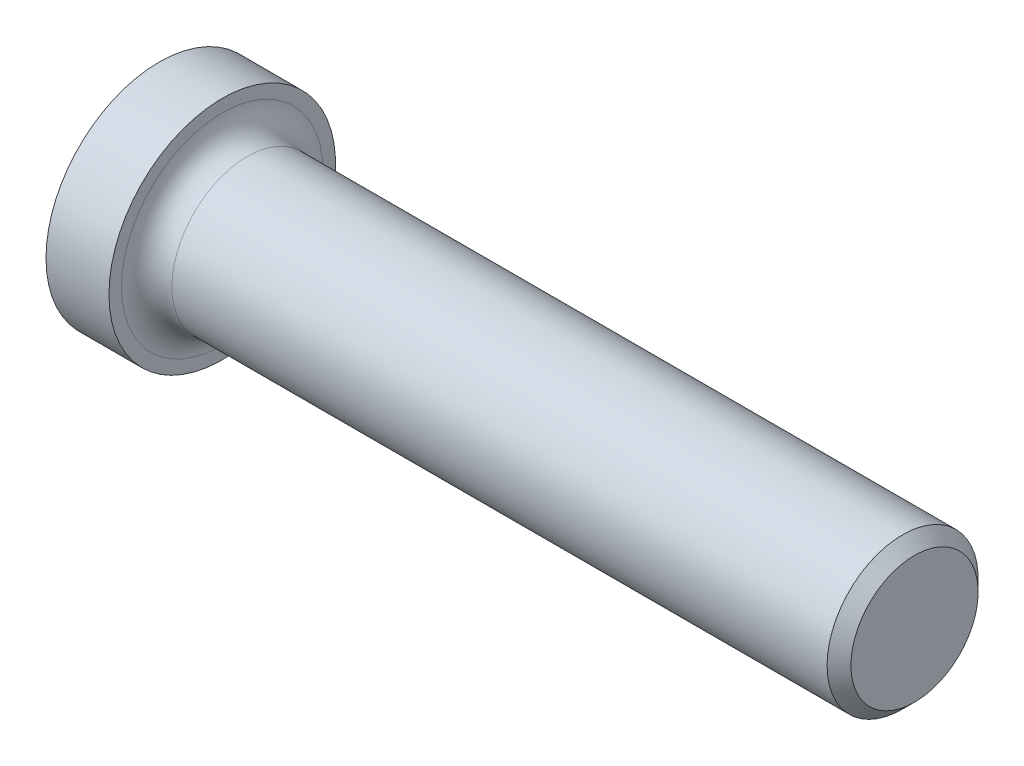
ISO-10303-21;
HEADER;
FILE_DESCRIPTION(('STEP AP214'),'2;1');
FILE_NAME('part.step','',(''),(''),'','','');
FILE_SCHEMA(('AUTOMOTIVE_DESIGN { 1 0 10303 214 1 1 1 1 }'));
ENDSEC;
DATA;
#1=APPLICATION_CONTEXT('core data for automotive mechanical design processes');
#2=APPLICATION_PROTOCOL_DEFINITION('international standard','automotive_design',2000,#1);
#3=PRODUCT_CONTEXT('',#1,'mechanical');
#4=PRODUCT('Part','Part','',(#3));
#5=PRODUCT_RELATED_PRODUCT_CATEGORY('part','',(#4));
#6=PRODUCT_DEFINITION_FORMATION('','',#4);
#7=PRODUCT_DEFINITION_CONTEXT('part definition',#1,'design');
#8=PRODUCT_DEFINITION('design','',#6,#7);
#9=PRODUCT_DEFINITION_SHAPE('','',#8);
#10=(LENGTH_UNIT() NAMED_UNIT(*) SI_UNIT(.MILLI.,.METRE.));
#11=(NAMED_UNIT(*) PLANE_ANGLE_UNIT() SI_UNIT($,.RADIAN.));
#12=(NAMED_UNIT(*) SI_UNIT($,.STERADIAN.) SOLID_ANGLE_UNIT());
#13=UNCERTAINTY_MEASURE_WITH_UNIT(LENGTH_MEASURE(1.E-05),#10,'distance_accuracy_value','');
#14=(GEOMETRIC_REPRESENTATION_CONTEXT(3) GLOBAL_UNCERTAINTY_ASSIGNED_CONTEXT((#13)) GLOBAL_UNIT_ASSIGNED_CONTEXT((#10,
#11,#12)) REPRESENTATION_CONTEXT('',''));
#15=CARTESIAN_POINT('',(0.,0.,0.));
#16=DIRECTION('',(0.,0.,1.));
#17=DIRECTION('',(1.,0.,0.));
#18=AXIS2_PLACEMENT_3D('',#15,#16,#17);
#19=CARTESIAN_POINT('',(0.,0.,0.));
#20=DIRECTION('',(-1.,0.,0.));
#21=DIRECTION('',(0.,0.,1.));
#22=AXIS2_PLACEMENT_3D('',#19,#20,#21);
#23=CYLINDRICAL_SURFACE('',#22,6.);
#24=CARTESIAN_POINT('',(59.053,0.,0.));
#25=DIRECTION('',(-1.,0.,0.));
#26=DIRECTION('',(0.,0.,1.));
#27=AXIS2_PLACEMENT_3D('',#24,#25,#26);
#28=CIRCLE('',#27,6.);
#29=CARTESIAN_POINT('',(59.053,0.,6.));
#30=VERTEX_POINT('',#29);
#31=EDGE_CURVE('E63',#30,#30,#28,.T.);
#32=ORIENTED_EDGE('',*,*,#31,.T.);
#33=EDGE_LOOP('',(#32));
#34=FACE_BOUND('',#33,.T.);
#35=CARTESIAN_POINT('',(7.00000000000002,0.,0.));
#36=DIRECTION('',(-1.,0.,0.));
#37=DIRECTION('',(0.,0.,1.));
#38=AXIS2_PLACEMENT_3D('',#35,#36,#37);
#39=CIRCLE('',#38,5.99999999999999);
#40=CARTESIAN_POINT('',(7.00000000000002,0.,5.99999999999999));
#41=VERTEX_POINT('',#40);
#42=EDGE_CURVE('E10',#41,#41,#39,.T.);
#43=ORIENTED_EDGE('',*,*,#42,.F.);
#44=EDGE_LOOP('',(#43));
#45=FACE_BOUND('',#44,.T.);
#46=ADVANCED_FACE('F43',(#34,#45),#23,.T.);
#47=CARTESIAN_POINT('',(7.,0.,0.));
#48=DIRECTION('',(-1.,0.,0.));
#49=DIRECTION('',(0.,0.,1.));
#50=AXIS2_PLACEMENT_3D('',#47,#48,#49);
#51=TOROIDAL_SURFACE('',#50,7.99999999999999,2.);
#52=CARTESIAN_POINT('',(5.,0.,0.));
#53=DIRECTION('',(-1.,0.,0.));
#54=DIRECTION('',(0.,0.,1.));
#55=AXIS2_PLACEMENT_3D('',#52,#53,#54);
#56=CIRCLE('',#55,7.99999999999999);
#57=CARTESIAN_POINT('',(5.,0.,7.99999999999999));
#58=VERTEX_POINT('',#57);
#59=EDGE_CURVE('E50',#58,#58,#56,.T.);
#60=ORIENTED_EDGE('',*,*,#59,.F.);
#61=EDGE_LOOP('',(#60));
#62=FACE_BOUND('',#61,.T.);
#63=ORIENTED_EDGE('',*,*,#42,.T.);
#64=EDGE_LOOP('',(#63));
#65=FACE_BOUND('',#64,.T.);
#66=ADVANCED_FACE('F81',(#62,#65),#51,.F.);
#67=CARTESIAN_POINT('',(5.,8.00000000000001,0.));
#68=DIRECTION('',(-1.,0.,0.));
#69=DIRECTION('',(0.,0.,1.));
#70=AXIS2_PLACEMENT_3D('',#67,#68,#69);
#71=PLANE('',#70);
#72=CARTESIAN_POINT('',(5.,0.,0.));
#73=DIRECTION('',(-1.,0.,0.));
#74=DIRECTION('',(0.,0.,1.));
#75=AXIS2_PLACEMENT_3D('',#72,#73,#74);
#76=CIRCLE('',#75,9.);
#77=CARTESIAN_POINT('',(5.,0.,9.));
#78=VERTEX_POINT('',#77);
#79=EDGE_CURVE('E54',#78,#78,#76,.T.);
#80=ORIENTED_EDGE('',*,*,#79,.F.);
#81=EDGE_LOOP('',(#80));
#82=FACE_BOUND('',#81,.T.);
#83=ORIENTED_EDGE('',*,*,#59,.T.);
#84=EDGE_LOOP('',(#83));
#85=FACE_BOUND('',#84,.T.);
#86=ADVANCED_FACE('F86',(#82,#85),#71,.F.);
#87=CARTESIAN_POINT('',(0.,0.,0.));
#88=DIRECTION('',(-1.,0.,0.));
#89=DIRECTION('',(0.,0.,1.));
#90=AXIS2_PLACEMENT_3D('',#87,#88,#89);
#91=CYLINDRICAL_SURFACE('',#90,9.);
#92=CARTESIAN_POINT('',(0.,0.,0.));
#93=DIRECTION('',(-1.,0.,0.));
#94=DIRECTION('',(0.,0.,1.));
#95=AXIS2_PLACEMENT_3D('',#92,#93,#94);
#96=CIRCLE('',#95,8.99999999999999);
#97=CARTESIAN_POINT('',(0.,0.,8.99999999999999));
#98=VERTEX_POINT('',#97);
#99=EDGE_CURVE('E58',#98,#98,#96,.T.);
#100=ORIENTED_EDGE('',*,*,#99,.F.);
#101=EDGE_LOOP('',(#100));
#102=FACE_BOUND('',#101,.T.);
#103=ORIENTED_EDGE('',*,*,#79,.T.);
#104=EDGE_LOOP('',(#103));
#105=FACE_BOUND('',#104,.T.);
#106=ADVANCED_FACE('F93',(#102,#105),#91,.T.);
#107=CARTESIAN_POINT('',(17.8605710994918,0.,0.));
#108=DIRECTION('',(-1.,0.,0.));
#109=DIRECTION('',(0.,1.,0.));
#110=AXIS2_PLACEMENT_3D('',#107,#108,#109);
#111=SPHERICAL_SURFACE('',#110,20.);
#112=ORIENTED_EDGE('',*,*,#99,.T.);
#113=EDGE_LOOP('',(#112));
#114=FACE_BOUND('',#113,.T.);
#115=ADVANCED_FACE('F77',(#114),#111,.T.);
#116=CARTESIAN_POINT('',(60.,0.,0.));
#117=DIRECTION('',(-1.,0.,0.));
#118=DIRECTION('',(0.,0.,1.));
#119=AXIS2_PLACEMENT_3D('',#116,#117,#118);
#120=CONICAL_SURFACE('',#119,5.053,0.785398163397453);
#121=ORIENTED_EDGE('',*,*,#31,.F.);
#122=EDGE_LOOP('',(#121));
#123=FACE_BOUND('',#122,.T.);
#124=CARTESIAN_POINT('',(60.,0.,0.));
#125=DIRECTION('',(-1.,0.,0.));
#126=DIRECTION('',(0.,0.,1.));
#127=AXIS2_PLACEMENT_3D('',#124,#125,#126);
#128=CIRCLE('',#127,5.053);
#129=CARTESIAN_POINT('',(60.,0.,5.053));
#130=VERTEX_POINT('',#129);
#131=EDGE_CURVE('E66',#130,#130,#128,.T.);
#132=ORIENTED_EDGE('',*,*,#131,.T.);
#133=EDGE_LOOP('',(#132));
#134=FACE_BOUND('',#133,.T.);
#135=ADVANCED_FACE('F70',(#123,#134),#120,.T.);
#136=CARTESIAN_POINT('',(60.,0.,0.));
#137=DIRECTION('',(-1.,0.,0.));
#138=DIRECTION('',(0.,0.,1.));
#139=AXIS2_PLACEMENT_3D('',#136,#137,#138);
#140=PLANE('',#139);
#141=ORIENTED_EDGE('',*,*,#131,.F.);
#142=EDGE_LOOP('',(#141));
#143=FACE_BOUND('',#142,.T.);
#144=ADVANCED_FACE('F45',(#143),#140,.F.);
#145=CLOSED_SHELL('',(#46,#66,#86,#106,#115,#135,#144));
#146=MANIFOLD_SOLID_BREP('B2',#145);
#147=ADVANCED_BREP_SHAPE_REPRESENTATION('',(#18,#146),#14);
#148=SHAPE_DEFINITION_REPRESENTATION(#9,#147);
ENDSEC;
END-ISO-10303-21;
